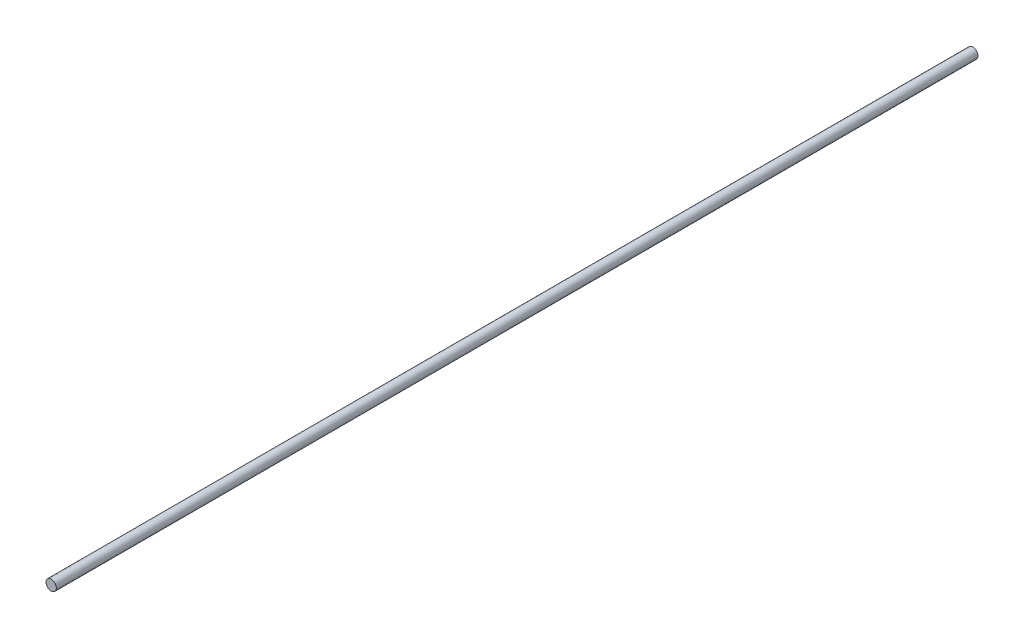
ISO-10303-21;
HEADER;
FILE_DESCRIPTION(('STEP AP214'),'2;1');
FILE_NAME('part.step','',(''),(''),'','','');
FILE_SCHEMA(('AUTOMOTIVE_DESIGN { 1 0 10303 214 1 1 1 1 }'));
ENDSEC;
DATA;
#1=APPLICATION_CONTEXT('core data for automotive mechanical design processes');
#2=APPLICATION_PROTOCOL_DEFINITION('international standard','automotive_design',2000,#1);
#3=PRODUCT_CONTEXT('',#1,'mechanical');
#4=PRODUCT('Part','Part','',(#3));
#5=PRODUCT_RELATED_PRODUCT_CATEGORY('part','',(#4));
#6=PRODUCT_DEFINITION_FORMATION('','',#4);
#7=PRODUCT_DEFINITION_CONTEXT('part definition',#1,'design');
#8=PRODUCT_DEFINITION('design','',#6,#7);
#9=PRODUCT_DEFINITION_SHAPE('','',#8);
#10=(LENGTH_UNIT() NAMED_UNIT(*) SI_UNIT(.MILLI.,.METRE.));
#11=(NAMED_UNIT(*) PLANE_ANGLE_UNIT() SI_UNIT($,.RADIAN.));
#12=(NAMED_UNIT(*) SI_UNIT($,.STERADIAN.) SOLID_ANGLE_UNIT());
#13=UNCERTAINTY_MEASURE_WITH_UNIT(LENGTH_MEASURE(1.E-05),#10,'distance_accuracy_value','');
#14=(GEOMETRIC_REPRESENTATION_CONTEXT(3) GLOBAL_UNCERTAINTY_ASSIGNED_CONTEXT((#13)) GLOBAL_UNIT_ASSIGNED_CONTEXT((#10,
#11,#12)) REPRESENTATION_CONTEXT('',''));
#15=CARTESIAN_POINT('',(0.,0.,0.));
#16=DIRECTION('',(0.,0.,1.));
#17=DIRECTION('',(1.,0.,0.));
#18=AXIS2_PLACEMENT_3D('',#15,#16,#17);
#19=CARTESIAN_POINT('',(0.,0.,400.));
#20=DIRECTION('',(0.,0.,-1.));
#21=DIRECTION('',(-1.,0.,0.));
#22=AXIS2_PLACEMENT_3D('',#19,#20,#21);
#23=CYLINDRICAL_SURFACE('',#22,4.5);
#24=CARTESIAN_POINT('',(0.,0.,400.));
#25=DIRECTION('',(0.,0.,1.));
#26=DIRECTION('',(1.,0.,0.));
#27=AXIS2_PLACEMENT_3D('',#24,#25,#26);
#28=CIRCLE('',#27,4.5);
#29=CARTESIAN_POINT('',(4.5,0.,400.));
#30=VERTEX_POINT('',#29);
#31=EDGE_CURVE('E10',#30,#30,#28,.T.);
#32=ORIENTED_EDGE('',*,*,#31,.F.);
#33=EDGE_LOOP('',(#32));
#34=FACE_BOUND('',#33,.T.);
#35=CARTESIAN_POINT('',(0.,0.,-400.));
#36=DIRECTION('',(0.,0.,1.));
#37=DIRECTION('',(1.,0.,0.));
#38=AXIS2_PLACEMENT_3D('',#35,#36,#37);
#39=CIRCLE('',#38,4.5);
#40=CARTESIAN_POINT('',(4.5,0.,-400.));
#41=VERTEX_POINT('',#40);
#42=EDGE_CURVE('E36',#41,#41,#39,.T.);
#43=ORIENTED_EDGE('',*,*,#42,.T.);
#44=EDGE_LOOP('',(#43));
#45=FACE_BOUND('',#44,.T.);
#46=ADVANCED_FACE('F33',(#34,#45),#23,.T.);
#47=CARTESIAN_POINT('',(0.,0.,400.));
#48=DIRECTION('',(0.,0.,1.));
#49=DIRECTION('',(1.,0.,0.));
#50=AXIS2_PLACEMENT_3D('',#47,#48,#49);
#51=PLANE('',#50);
#52=ORIENTED_EDGE('',*,*,#31,.T.);
#53=EDGE_LOOP('',(#52));
#54=FACE_BOUND('',#53,.T.);
#55=ADVANCED_FACE('F48',(#54),#51,.T.);
#56=CARTESIAN_POINT('',(0.,0.,-400.));
#57=DIRECTION('',(0.,0.,1.));
#58=DIRECTION('',(1.,0.,0.));
#59=AXIS2_PLACEMENT_3D('',#56,#57,#58);
#60=PLANE('',#59);
#61=ORIENTED_EDGE('',*,*,#42,.F.);
#62=EDGE_LOOP('',(#61));
#63=FACE_BOUND('',#62,.T.);
#64=ADVANCED_FACE('F46',(#63),#60,.F.);
#65=CLOSED_SHELL('',(#46,#55,#64));
#66=MANIFOLD_SOLID_BREP('B2',#65);
#67=ADVANCED_BREP_SHAPE_REPRESENTATION('',(#18,#66),#14);
#68=SHAPE_DEFINITION_REPRESENTATION(#9,#67);
ENDSEC;
END-ISO-10303-21;
